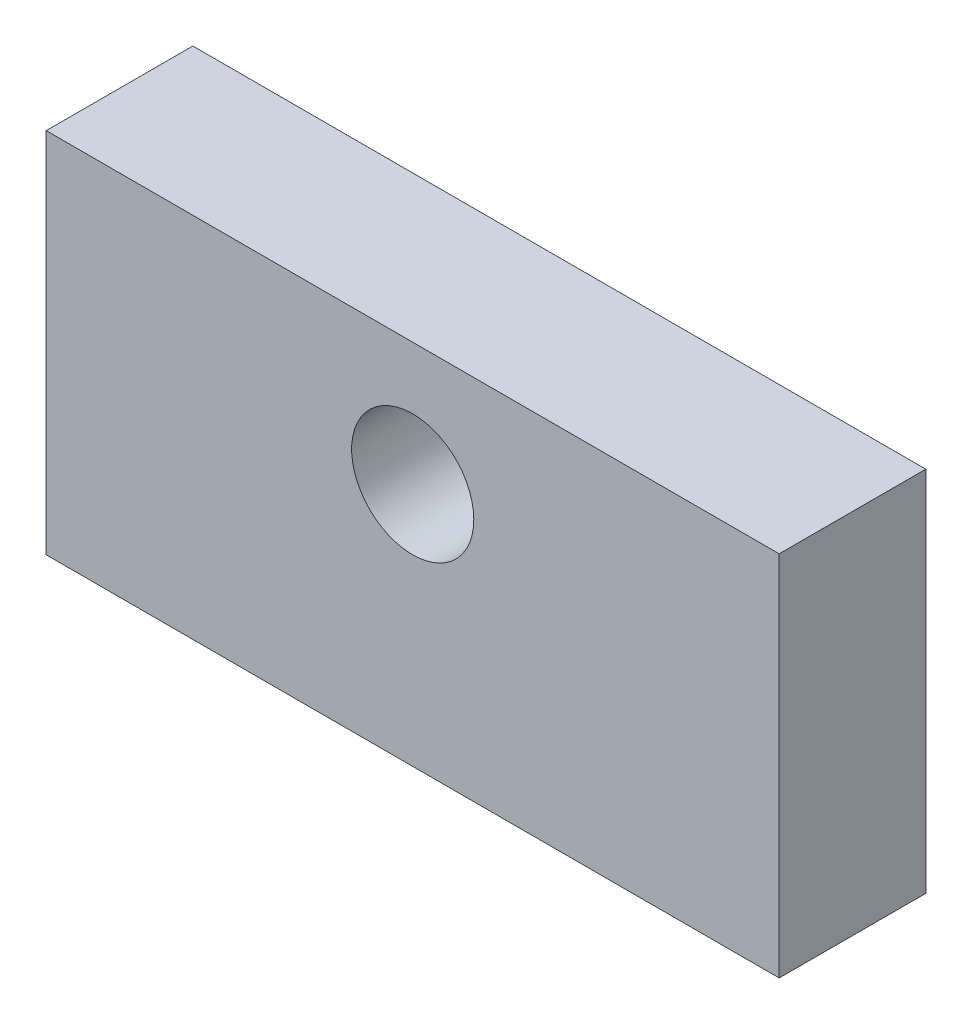
ISO-10303-21;
HEADER;
FILE_DESCRIPTION(('STEP AP214'),'2;1');
FILE_NAME('part.step','',(''),(''),'','','');
FILE_SCHEMA(('AUTOMOTIVE_DESIGN { 1 0 10303 214 1 1 1 1 }'));
ENDSEC;
DATA;
#1=APPLICATION_CONTEXT('core data for automotive mechanical design processes');
#2=APPLICATION_PROTOCOL_DEFINITION('international standard','automotive_design',2000,#1);
#3=PRODUCT_CONTEXT('',#1,'mechanical');
#4=PRODUCT('Part','Part','',(#3));
#5=PRODUCT_RELATED_PRODUCT_CATEGORY('part','',(#4));
#6=PRODUCT_DEFINITION_FORMATION('','',#4);
#7=PRODUCT_DEFINITION_CONTEXT('part definition',#1,'design');
#8=PRODUCT_DEFINITION('design','',#6,#7);
#9=PRODUCT_DEFINITION_SHAPE('','',#8);
#10=(LENGTH_UNIT() NAMED_UNIT(*) SI_UNIT(.MILLI.,.METRE.));
#11=(NAMED_UNIT(*) PLANE_ANGLE_UNIT() SI_UNIT($,.RADIAN.));
#12=(NAMED_UNIT(*) SI_UNIT($,.STERADIAN.) SOLID_ANGLE_UNIT());
#13=UNCERTAINTY_MEASURE_WITH_UNIT(LENGTH_MEASURE(1.E-05),#10,'distance_accuracy_value','');
#14=(GEOMETRIC_REPRESENTATION_CONTEXT(3) GLOBAL_UNCERTAINTY_ASSIGNED_CONTEXT((#13)) GLOBAL_UNIT_ASSIGNED_CONTEXT((#10,
#11,#12)) REPRESENTATION_CONTEXT('',''));
#15=CARTESIAN_POINT('',(0.,0.,0.));
#16=DIRECTION('',(0.,0.,1.));
#17=DIRECTION('',(1.,0.,0.));
#18=AXIS2_PLACEMENT_3D('',#15,#16,#17);
#19=CARTESIAN_POINT('',(-11.55672975799,3.8903028272637,6.));
#20=DIRECTION('',(1.,0.,0.));
#21=DIRECTION('',(0.,1.,0.));
#22=AXIS2_PLACEMENT_3D('',#19,#20,#21);
#23=PLANE('',#22);
#24=DIRECTION('',(0.,-1.,0.));
#25=VECTOR('',#24,1.);
#26=CARTESIAN_POINT('',(-11.55672975799,3.8903028272637,0.));
#27=LINE('',#26,#25);
#28=CARTESIAN_POINT('',(-11.55672975799,3.8903028272637,0.));
#29=VERTEX_POINT('',#28);
#30=CARTESIAN_POINT('',(-11.55672975799,-11.1460315219687,0.));
#31=VERTEX_POINT('',#30);
#32=EDGE_CURVE('E94',#29,#31,#27,.T.);
#33=ORIENTED_EDGE('',*,*,#32,.T.);
#34=DIRECTION('',(0.,0.,-1.));
#35=VECTOR('',#34,1.);
#36=CARTESIAN_POINT('',(-11.55672975799,-11.1460315219687,6.));
#37=LINE('',#36,#35);
#38=CARTESIAN_POINT('',(-11.55672975799,-11.1460315219687,6.));
#39=VERTEX_POINT('',#38);
#40=EDGE_CURVE('E11',#39,#31,#37,.T.);
#41=ORIENTED_EDGE('',*,*,#40,.F.);
#42=DIRECTION('',(0.,-1.,0.));
#43=VECTOR('',#42,1.);
#44=CARTESIAN_POINT('',(-11.55672975799,3.8903028272637,6.));
#45=LINE('',#44,#43);
#46=CARTESIAN_POINT('',(-11.55672975799,3.8903028272637,6.));
#47=VERTEX_POINT('',#46);
#48=EDGE_CURVE('E82',#47,#39,#45,.T.);
#49=ORIENTED_EDGE('',*,*,#48,.F.);
#50=DIRECTION('',(0.,0.,-1.));
#51=VECTOR('',#50,1.);
#52=CARTESIAN_POINT('',(-11.55672975799,3.8903028272637,6.));
#53=LINE('',#52,#51);
#54=EDGE_CURVE('E90',#47,#29,#53,.T.);
#55=ORIENTED_EDGE('',*,*,#54,.T.);
#56=EDGE_LOOP('',(#33,#41,#49,#55));
#57=FACE_BOUND('',#56,.T.);
#58=ADVANCED_FACE('F31',(#57),#23,.F.);
#59=CARTESIAN_POINT('',(-11.55672975799,-11.1460315219687,6.));
#60=DIRECTION('',(0.,1.,0.));
#61=DIRECTION('',(0.,0.,1.));
#62=AXIS2_PLACEMENT_3D('',#59,#60,#61);
#63=PLANE('',#62);
#64=DIRECTION('',(1.,0.,0.));
#65=VECTOR('',#64,1.);
#66=CARTESIAN_POINT('',(-11.55672975799,-11.1460315219687,0.));
#67=LINE('',#66,#65);
#68=CARTESIAN_POINT('',(18.44327024201,-11.1460315219687,0.));
#69=VERTEX_POINT('',#68);
#70=EDGE_CURVE('E86',#31,#69,#67,.T.);
#71=ORIENTED_EDGE('',*,*,#70,.T.);
#72=DIRECTION('',(0.,0.,-1.));
#73=VECTOR('',#72,1.);
#74=CARTESIAN_POINT('',(18.44327024201,-11.1460315219687,6.));
#75=LINE('',#74,#73);
#76=CARTESIAN_POINT('',(18.44327024201,-11.1460315219687,6.));
#77=VERTEX_POINT('',#76);
#78=EDGE_CURVE('E39',#77,#69,#75,.T.);
#79=ORIENTED_EDGE('',*,*,#78,.F.);
#80=DIRECTION('',(1.,0.,0.));
#81=VECTOR('',#80,1.);
#82=CARTESIAN_POINT('',(-11.55672975799,-11.1460315219687,6.));
#83=LINE('',#82,#81);
#84=EDGE_CURVE('E77',#39,#77,#83,.T.);
#85=ORIENTED_EDGE('',*,*,#84,.F.);
#86=ORIENTED_EDGE('',*,*,#40,.T.);
#87=EDGE_LOOP('',(#71,#79,#85,#86));
#88=FACE_BOUND('',#87,.T.);
#89=ADVANCED_FACE('F85',(#88),#63,.F.);
#90=CARTESIAN_POINT('',(18.44327024201,3.8903028272637,6.));
#91=DIRECTION('',(-1.,0.,0.));
#92=DIRECTION('',(0.,-1.,0.));
#93=AXIS2_PLACEMENT_3D('',#90,#91,#92);
#94=PLANE('',#93);
#95=DIRECTION('',(0.,1.,0.));
#96=VECTOR('',#95,1.);
#97=CARTESIAN_POINT('',(18.44327024201,3.8903028272637,0.));
#98=LINE('',#97,#96);
#99=CARTESIAN_POINT('',(18.44327024201,3.8903028272637,0.));
#100=VERTEX_POINT('',#99);
#101=EDGE_CURVE('E64',#69,#100,#98,.T.);
#102=ORIENTED_EDGE('',*,*,#101,.T.);
#103=DIRECTION('',(0.,0.,-1.));
#104=VECTOR('',#103,1.);
#105=CARTESIAN_POINT('',(18.44327024201,3.8903028272637,6.));
#106=LINE('',#105,#104);
#107=CARTESIAN_POINT('',(18.44327024201,3.8903028272637,6.));
#108=VERTEX_POINT('',#107);
#109=EDGE_CURVE('E87',#108,#100,#106,.T.);
#110=ORIENTED_EDGE('',*,*,#109,.F.);
#111=DIRECTION('',(0.,1.,0.));
#112=VECTOR('',#111,1.);
#113=CARTESIAN_POINT('',(18.44327024201,3.8903028272637,6.));
#114=LINE('',#113,#112);
#115=EDGE_CURVE('E80',#77,#108,#114,.T.);
#116=ORIENTED_EDGE('',*,*,#115,.F.);
#117=ORIENTED_EDGE('',*,*,#78,.T.);
#118=EDGE_LOOP('',(#102,#110,#116,#117));
#119=FACE_BOUND('',#118,.T.);
#120=ADVANCED_FACE('F88',(#119),#94,.F.);
#121=CARTESIAN_POINT('',(-11.55672975799,3.8903028272637,6.));
#122=DIRECTION('',(0.,-1.,0.));
#123=DIRECTION('',(0.,0.,-1.));
#124=AXIS2_PLACEMENT_3D('',#121,#122,#123);
#125=PLANE('',#124);
#126=DIRECTION('',(-1.,0.,0.));
#127=VECTOR('',#126,1.);
#128=CARTESIAN_POINT('',(-11.55672975799,3.8903028272637,0.));
#129=LINE('',#128,#127);
#130=EDGE_CURVE('E70',#100,#29,#129,.T.);
#131=ORIENTED_EDGE('',*,*,#130,.T.);
#132=ORIENTED_EDGE('',*,*,#54,.F.);
#133=DIRECTION('',(-1.,0.,0.));
#134=VECTOR('',#133,1.);
#135=CARTESIAN_POINT('',(-11.55672975799,3.8903028272637,6.));
#136=LINE('',#135,#134);
#137=EDGE_CURVE('E47',#108,#47,#136,.T.);
#138=ORIENTED_EDGE('',*,*,#137,.F.);
#139=ORIENTED_EDGE('',*,*,#109,.T.);
#140=EDGE_LOOP('',(#131,#132,#138,#139));
#141=FACE_BOUND('',#140,.T.);
#142=ADVANCED_FACE('F102',(#141),#125,.F.);
#143=CARTESIAN_POINT('',(-11.55672975799,-11.1460315219687,6.));
#144=DIRECTION('',(0.,0.,1.));
#145=DIRECTION('',(1.,0.,0.));
#146=AXIS2_PLACEMENT_3D('',#143,#144,#145);
#147=PLANE('',#146);
#148=CARTESIAN_POINT('',(3.44327024200999,-1.14603176973458,6.));
#149=DIRECTION('',(0.,0.,1.));
#150=DIRECTION('',(1.,0.,0.));
#151=AXIS2_PLACEMENT_3D('',#148,#149,#150);
#152=CIRCLE('',#151,2.5);
#153=CARTESIAN_POINT('',(5.94327024200999,-1.14603176973458,6.));
#154=VERTEX_POINT('',#153);
#155=EDGE_CURVE('E108',#154,#154,#152,.T.);
#156=ORIENTED_EDGE('',*,*,#155,.F.);
#157=EDGE_LOOP('',(#156));
#158=FACE_BOUND('',#157,.T.);
#159=ORIENTED_EDGE('',*,*,#48,.T.);
#160=ORIENTED_EDGE('',*,*,#84,.T.);
#161=ORIENTED_EDGE('',*,*,#115,.T.);
#162=ORIENTED_EDGE('',*,*,#137,.T.);
#163=EDGE_LOOP('',(#159,#160,#161,#162));
#164=FACE_BOUND('',#163,.T.);
#165=ADVANCED_FACE('F78',(#158,#164),#147,.T.);
#166=CARTESIAN_POINT('',(-11.55672975799,-11.1460315219687,0.));
#167=DIRECTION('',(0.,0.,1.));
#168=DIRECTION('',(1.,0.,0.));
#169=AXIS2_PLACEMENT_3D('',#166,#167,#168);
#170=PLANE('',#169);
#171=ORIENTED_EDGE('',*,*,#32,.F.);
#172=ORIENTED_EDGE('',*,*,#130,.F.);
#173=ORIENTED_EDGE('',*,*,#101,.F.);
#174=ORIENTED_EDGE('',*,*,#70,.F.);
#175=EDGE_LOOP('',(#171,#172,#173,#174));
#176=FACE_BOUND('',#175,.T.);
#177=ADVANCED_FACE('F105',(#176),#170,.F.);
#178=CARTESIAN_POINT('',(3.44327024200999,-1.14603176973458,2.));
#179=DIRECTION('',(0.,0.,1.));
#180=DIRECTION('',(1.,0.,0.));
#181=AXIS2_PLACEMENT_3D('',#178,#179,#180);
#182=CYLINDRICAL_SURFACE('',#181,2.5);
#183=CARTESIAN_POINT('',(3.44327024200999,-1.14603176973458,2.));
#184=DIRECTION('',(0.,0.,1.));
#185=DIRECTION('',(1.,0.,0.));
#186=AXIS2_PLACEMENT_3D('',#183,#184,#185);
#187=CIRCLE('',#186,2.5);
#188=CARTESIAN_POINT('',(5.94327024200999,-1.14603176973458,2.));
#189=VERTEX_POINT('',#188);
#190=EDGE_CURVE('E97',#189,#189,#187,.T.);
#191=ORIENTED_EDGE('',*,*,#190,.F.);
#192=EDGE_LOOP('',(#191));
#193=FACE_BOUND('',#192,.T.);
#194=ORIENTED_EDGE('',*,*,#155,.T.);
#195=EDGE_LOOP('',(#194));
#196=FACE_BOUND('',#195,.T.);
#197=ADVANCED_FACE('F116',(#193,#196),#182,.F.);
#198=CARTESIAN_POINT('',(3.44327024200999,-1.14603176973458,2.));
#199=DIRECTION('',(0.,0.,1.));
#200=DIRECTION('',(1.,0.,0.));
#201=AXIS2_PLACEMENT_3D('',#198,#199,#200);
#202=PLANE('',#201);
#203=ORIENTED_EDGE('',*,*,#190,.T.);
#204=EDGE_LOOP('',(#203));
#205=FACE_BOUND('',#204,.T.);
#206=ADVANCED_FACE('F114',(#205),#202,.T.);
#207=CLOSED_SHELL('',(#58,#89,#120,#142,#165,#177,#197,#206));
#208=MANIFOLD_SOLID_BREP('B2',#207);
#209=ADVANCED_BREP_SHAPE_REPRESENTATION('',(#18,#208),#14);
#210=SHAPE_DEFINITION_REPRESENTATION(#9,#209);
ENDSEC;
END-ISO-10303-21;
